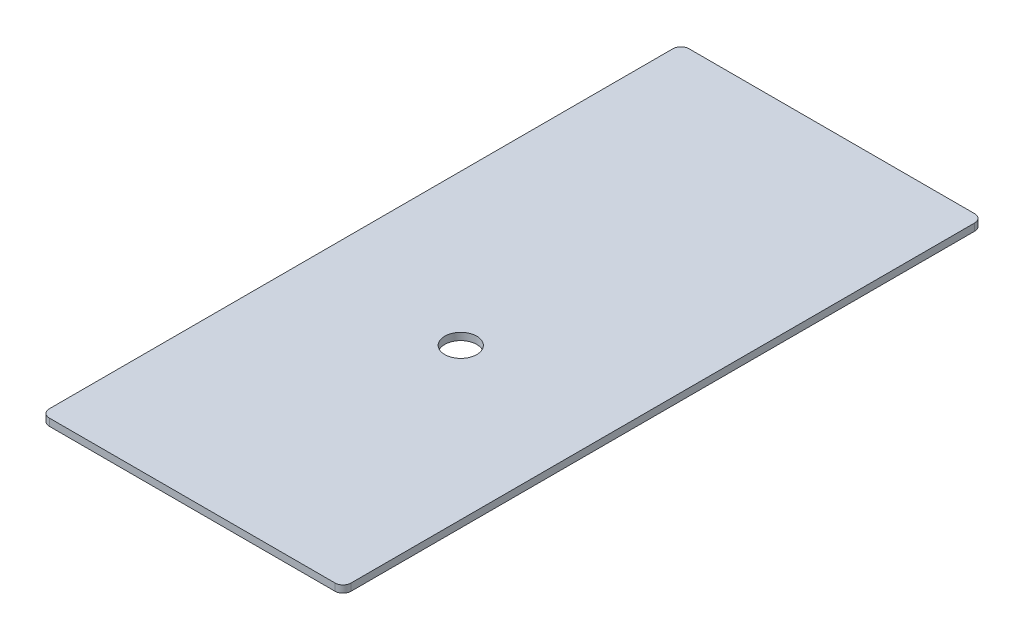
ISO-10303-21;
HEADER;
FILE_DESCRIPTION(('STEP AP214'),'2;1');
FILE_NAME('part.step','',(''),(''),'','','');
FILE_SCHEMA(('AUTOMOTIVE_DESIGN { 1 0 10303 214 1 1 1 1 }'));
ENDSEC;
DATA;
#1=APPLICATION_CONTEXT('core data for automotive mechanical design processes');
#2=APPLICATION_PROTOCOL_DEFINITION('international standard','automotive_design',2000,#1);
#3=PRODUCT_CONTEXT('',#1,'mechanical');
#4=PRODUCT('Part','Part','',(#3));
#5=PRODUCT_RELATED_PRODUCT_CATEGORY('part','',(#4));
#6=PRODUCT_DEFINITION_FORMATION('','',#4);
#7=PRODUCT_DEFINITION_CONTEXT('part definition',#1,'design');
#8=PRODUCT_DEFINITION('design','',#6,#7);
#9=PRODUCT_DEFINITION_SHAPE('','',#8);
#10=(LENGTH_UNIT() NAMED_UNIT(*) SI_UNIT(.MILLI.,.METRE.));
#11=(NAMED_UNIT(*) PLANE_ANGLE_UNIT() SI_UNIT($,.RADIAN.));
#12=(NAMED_UNIT(*) SI_UNIT($,.STERADIAN.) SOLID_ANGLE_UNIT());
#13=UNCERTAINTY_MEASURE_WITH_UNIT(LENGTH_MEASURE(1.E-05),#10,'distance_accuracy_value','');
#14=(GEOMETRIC_REPRESENTATION_CONTEXT(3) GLOBAL_UNCERTAINTY_ASSIGNED_CONTEXT((#13)) GLOBAL_UNIT_ASSIGNED_CONTEXT((#10,
#11,#12)) REPRESENTATION_CONTEXT('',''));
#15=CARTESIAN_POINT('',(0.,0.,0.));
#16=DIRECTION('',(0.,0.,1.));
#17=DIRECTION('',(1.,0.,0.));
#18=AXIS2_PLACEMENT_3D('',#15,#16,#17);
#19=CARTESIAN_POINT('',(0.,4.5,0.));
#20=DIRECTION('',(1.,0.,0.));
#21=DIRECTION('',(0.,0.,-1.));
#22=AXIS2_PLACEMENT_3D('',#19,#20,#21);
#23=PLANE('',#22);
#24=DIRECTION('',(0.,0.,1.));
#25=VECTOR('',#24,1.);
#26=CARTESIAN_POINT('',(0.,4.5,0.));
#27=LINE('',#26,#25);
#28=CARTESIAN_POINT('',(0.,4.5,-395.));
#29=VERTEX_POINT('',#28);
#30=CARTESIAN_POINT('',(0.,4.5,-5.));
#31=VERTEX_POINT('',#30);
#32=EDGE_CURVE('E131',#29,#31,#27,.T.);
#33=ORIENTED_EDGE('',*,*,#32,.F.);
#34=DIRECTION('',(0.,-1.,0.));
#35=VECTOR('',#34,1.);
#36=CARTESIAN_POINT('',(0.,4.5,-395.));
#37=LINE('',#36,#35);
#38=CARTESIAN_POINT('',(0.,0.,-395.));
#39=VERTEX_POINT('',#38);
#40=EDGE_CURVE('E116',#29,#39,#37,.T.);
#41=ORIENTED_EDGE('',*,*,#40,.T.);
#42=DIRECTION('',(0.,0.,1.));
#43=VECTOR('',#42,1.);
#44=CARTESIAN_POINT('',(0.,0.,0.));
#45=LINE('',#44,#43);
#46=CARTESIAN_POINT('',(0.,0.,-5.));
#47=VERTEX_POINT('',#46);
#48=EDGE_CURVE('E128',#39,#47,#45,.T.);
#49=ORIENTED_EDGE('',*,*,#48,.T.);
#50=DIRECTION('',(0.,-1.,0.));
#51=VECTOR('',#50,1.);
#52=CARTESIAN_POINT('',(0.,4.5,-5.));
#53=LINE('',#52,#51);
#54=EDGE_CURVE('E133',#47,#31,#53,.F.);
#55=ORIENTED_EDGE('',*,*,#54,.T.);
#56=EDGE_LOOP('',(#33,#41,#49,#55));
#57=FACE_BOUND('',#56,.T.);
#58=ADVANCED_FACE('F44',(#57),#23,.F.);
#59=CARTESIAN_POINT('',(0.,4.5,0.));
#60=DIRECTION('',(0.,0.,-1.));
#61=DIRECTION('',(-1.,0.,0.));
#62=AXIS2_PLACEMENT_3D('',#59,#60,#61);
#63=PLANE('',#62);
#64=DIRECTION('',(1.,0.,0.));
#65=VECTOR('',#64,1.);
#66=CARTESIAN_POINT('',(0.,4.5,0.));
#67=LINE('',#66,#65);
#68=CARTESIAN_POINT('',(5.,4.5,0.));
#69=VERTEX_POINT('',#68);
#70=CARTESIAN_POINT('',(183.7,4.5,0.));
#71=VERTEX_POINT('',#70);
#72=EDGE_CURVE('E174',#69,#71,#67,.T.);
#73=ORIENTED_EDGE('',*,*,#72,.F.);
#74=DIRECTION('',(0.,-1.,0.));
#75=VECTOR('',#74,1.);
#76=CARTESIAN_POINT('',(5.,4.5,0.));
#77=LINE('',#76,#75);
#78=CARTESIAN_POINT('',(5.,0.,0.));
#79=VERTEX_POINT('',#78);
#80=EDGE_CURVE('E11',#69,#79,#77,.T.);
#81=ORIENTED_EDGE('',*,*,#80,.T.);
#82=DIRECTION('',(1.,0.,0.));
#83=VECTOR('',#82,1.);
#84=CARTESIAN_POINT('',(0.,0.,0.));
#85=LINE('',#84,#83);
#86=CARTESIAN_POINT('',(183.7,0.,0.));
#87=VERTEX_POINT('',#86);
#88=EDGE_CURVE('E138',#79,#87,#85,.T.);
#89=ORIENTED_EDGE('',*,*,#88,.T.);
#90=DIRECTION('',(0.,-1.,0.));
#91=VECTOR('',#90,1.);
#92=CARTESIAN_POINT('',(183.7,4.5,0.));
#93=LINE('',#92,#91);
#94=EDGE_CURVE('E53',#87,#71,#93,.F.);
#95=ORIENTED_EDGE('',*,*,#94,.T.);
#96=EDGE_LOOP('',(#73,#81,#89,#95));
#97=FACE_BOUND('',#96,.T.);
#98=ADVANCED_FACE('F173',(#97),#63,.F.);
#99=CARTESIAN_POINT('',(188.7,4.5,0.));
#100=DIRECTION('',(-1.,0.,0.));
#101=DIRECTION('',(0.,0.,1.));
#102=AXIS2_PLACEMENT_3D('',#99,#100,#101);
#103=PLANE('',#102);
#104=DIRECTION('',(0.,0.,-1.));
#105=VECTOR('',#104,1.);
#106=CARTESIAN_POINT('',(188.7,0.,0.));
#107=LINE('',#106,#105);
#108=CARTESIAN_POINT('',(188.7,0.,-5.));
#109=VERTEX_POINT('',#108);
#110=CARTESIAN_POINT('',(188.7,0.,-395.));
#111=VERTEX_POINT('',#110);
#112=EDGE_CURVE('E141',#109,#111,#107,.T.);
#113=ORIENTED_EDGE('',*,*,#112,.T.);
#114=DIRECTION('',(0.,-1.,0.));
#115=VECTOR('',#114,1.);
#116=CARTESIAN_POINT('',(188.7,4.5,-395.));
#117=LINE('',#116,#115);
#118=CARTESIAN_POINT('',(188.7,4.5,-395.));
#119=VERTEX_POINT('',#118);
#120=EDGE_CURVE('E60',#111,#119,#117,.F.);
#121=ORIENTED_EDGE('',*,*,#120,.T.);
#122=DIRECTION('',(0.,0.,-1.));
#123=VECTOR('',#122,1.);
#124=CARTESIAN_POINT('',(188.7,4.5,0.));
#125=LINE('',#124,#123);
#126=CARTESIAN_POINT('',(188.7,4.5,-5.));
#127=VERTEX_POINT('',#126);
#128=EDGE_CURVE('E180',#127,#119,#125,.T.);
#129=ORIENTED_EDGE('',*,*,#128,.F.);
#130=DIRECTION('',(0.,-1.,0.));
#131=VECTOR('',#130,1.);
#132=CARTESIAN_POINT('',(188.7,4.5,-5.));
#133=LINE('',#132,#131);
#134=EDGE_CURVE('E166',#127,#109,#133,.T.);
#135=ORIENTED_EDGE('',*,*,#134,.T.);
#136=EDGE_LOOP('',(#113,#121,#129,#135));
#137=FACE_BOUND('',#136,.T.);
#138=ADVANCED_FACE('F184',(#137),#103,.F.);
#139=CARTESIAN_POINT('',(0.,4.5,-400.));
#140=DIRECTION('',(0.,0.,1.));
#141=DIRECTION('',(1.,0.,0.));
#142=AXIS2_PLACEMENT_3D('',#139,#140,#141);
#143=PLANE('',#142);
#144=DIRECTION('',(-1.,0.,0.));
#145=VECTOR('',#144,1.);
#146=CARTESIAN_POINT('',(0.,0.,-400.));
#147=LINE('',#146,#145);
#148=CARTESIAN_POINT('',(183.7,0.,-400.));
#149=VERTEX_POINT('',#148);
#150=CARTESIAN_POINT('',(5.,0.,-400.));
#151=VERTEX_POINT('',#150);
#152=EDGE_CURVE('E150',#149,#151,#147,.T.);
#153=ORIENTED_EDGE('',*,*,#152,.T.);
#154=DIRECTION('',(0.,-1.,0.));
#155=VECTOR('',#154,1.);
#156=CARTESIAN_POINT('',(5.,4.5,-400.));
#157=LINE('',#156,#155);
#158=CARTESIAN_POINT('',(5.,4.5,-400.));
#159=VERTEX_POINT('',#158);
#160=EDGE_CURVE('E117',#151,#159,#157,.F.);
#161=ORIENTED_EDGE('',*,*,#160,.T.);
#162=DIRECTION('',(-1.,0.,0.));
#163=VECTOR('',#162,1.);
#164=CARTESIAN_POINT('',(0.,4.5,-400.));
#165=LINE('',#164,#163);
#166=CARTESIAN_POINT('',(183.7,4.5,-400.));
#167=VERTEX_POINT('',#166);
#168=EDGE_CURVE('E146',#167,#159,#165,.T.);
#169=ORIENTED_EDGE('',*,*,#168,.F.);
#170=DIRECTION('',(0.,-1.,0.));
#171=VECTOR('',#170,1.);
#172=CARTESIAN_POINT('',(183.7,4.5,-400.));
#173=LINE('',#172,#171);
#174=EDGE_CURVE('E122',#167,#149,#173,.T.);
#175=ORIENTED_EDGE('',*,*,#174,.T.);
#176=EDGE_LOOP('',(#153,#161,#169,#175));
#177=FACE_BOUND('',#176,.T.);
#178=ADVANCED_FACE('F191',(#177),#143,.F.);
#179=CARTESIAN_POINT('',(0.,4.5,0.));
#180=DIRECTION('',(0.,-1.,0.));
#181=DIRECTION('',(0.,0.,-1.));
#182=AXIS2_PLACEMENT_3D('',#179,#180,#181);
#183=PLANE('',#182);
#184=CARTESIAN_POINT('',(94.3066017177937,4.5,-168.));
#185=DIRECTION('',(0.,1.,0.));
#186=DIRECTION('',(0.,0.,1.));
#187=AXIS2_PLACEMENT_3D('',#184,#185,#186);
#188=CIRCLE('',#187,10.);
#189=CARTESIAN_POINT('',(94.3066017177937,4.5,-158.));
#190=VERTEX_POINT('',#189);
#191=EDGE_CURVE('E144',#190,#190,#188,.T.);
#192=ORIENTED_EDGE('',*,*,#191,.F.);
#193=EDGE_LOOP('',(#192));
#194=FACE_BOUND('',#193,.T.);
#195=ORIENTED_EDGE('',*,*,#168,.T.);
#196=CARTESIAN_POINT('',(5.,4.5,-395.));
#197=DIRECTION('',(0.,-1.,0.));
#198=DIRECTION('',(0.,0.,-1.));
#199=AXIS2_PLACEMENT_3D('',#196,#197,#198);
#200=CIRCLE('',#199,5.);
#201=EDGE_CURVE('E164',#159,#29,#200,.F.);
#202=ORIENTED_EDGE('',*,*,#201,.T.);
#203=ORIENTED_EDGE('',*,*,#32,.T.);
#204=CARTESIAN_POINT('',(5.,4.5,-5.));
#205=DIRECTION('',(0.,-1.,0.));
#206=DIRECTION('',(0.,0.,-1.));
#207=AXIS2_PLACEMENT_3D('',#204,#205,#206);
#208=CIRCLE('',#207,5.);
#209=EDGE_CURVE('E160',#31,#69,#208,.F.);
#210=ORIENTED_EDGE('',*,*,#209,.T.);
#211=ORIENTED_EDGE('',*,*,#72,.T.);
#212=CARTESIAN_POINT('',(183.7,4.5,-5.));
#213=DIRECTION('',(0.,-1.,0.));
#214=DIRECTION('',(0.,0.,-1.));
#215=AXIS2_PLACEMENT_3D('',#212,#213,#214);
#216=CIRCLE('',#215,5.);
#217=EDGE_CURVE('E67',#71,#127,#216,.F.);
#218=ORIENTED_EDGE('',*,*,#217,.T.);
#219=ORIENTED_EDGE('',*,*,#128,.T.);
#220=CARTESIAN_POINT('',(183.7,4.5,-395.));
#221=DIRECTION('',(0.,-1.,0.));
#222=DIRECTION('',(0.,0.,-1.));
#223=AXIS2_PLACEMENT_3D('',#220,#221,#222);
#224=CIRCLE('',#223,5.);
#225=EDGE_CURVE('E162',#119,#167,#224,.F.);
#226=ORIENTED_EDGE('',*,*,#225,.T.);
#227=EDGE_LOOP('',(#195,#202,#203,#210,#211,#218,#219,#226));
#228=FACE_BOUND('',#227,.T.);
#229=ADVANCED_FACE('F178',(#194,#228),#183,.F.);
#230=CARTESIAN_POINT('',(0.,0.,0.));
#231=DIRECTION('',(0.,-1.,0.));
#232=DIRECTION('',(0.,0.,-1.));
#233=AXIS2_PLACEMENT_3D('',#230,#231,#232);
#234=PLANE('',#233);
#235=CARTESIAN_POINT('',(94.3066017177937,0.,-168.));
#236=DIRECTION('',(0.,-1.,0.));
#237=DIRECTION('',(0.,0.,-1.));
#238=AXIS2_PLACEMENT_3D('',#235,#236,#237);
#239=CIRCLE('',#238,10.);
#240=CARTESIAN_POINT('',(94.3066017177937,0.,-178.));
#241=VERTEX_POINT('',#240);
#242=EDGE_CURVE('E48',#241,#241,#239,.T.);
#243=ORIENTED_EDGE('',*,*,#242,.F.);
#244=EDGE_LOOP('',(#243));
#245=FACE_BOUND('',#244,.T.);
#246=ORIENTED_EDGE('',*,*,#48,.F.);
#247=CARTESIAN_POINT('',(5.,0.,-395.));
#248=DIRECTION('',(0.,-1.,0.));
#249=DIRECTION('',(0.,0.,-1.));
#250=AXIS2_PLACEMENT_3D('',#247,#248,#249);
#251=CIRCLE('',#250,5.);
#252=EDGE_CURVE('E112',#39,#151,#251,.T.);
#253=ORIENTED_EDGE('',*,*,#252,.T.);
#254=ORIENTED_EDGE('',*,*,#152,.F.);
#255=CARTESIAN_POINT('',(183.7,0.,-395.));
#256=DIRECTION('',(0.,-1.,0.));
#257=DIRECTION('',(0.,0.,-1.));
#258=AXIS2_PLACEMENT_3D('',#255,#256,#257);
#259=CIRCLE('',#258,5.);
#260=EDGE_CURVE('E123',#149,#111,#259,.T.);
#261=ORIENTED_EDGE('',*,*,#260,.T.);
#262=ORIENTED_EDGE('',*,*,#112,.F.);
#263=CARTESIAN_POINT('',(183.7,0.,-5.));
#264=DIRECTION('',(0.,-1.,0.));
#265=DIRECTION('',(0.,0.,-1.));
#266=AXIS2_PLACEMENT_3D('',#263,#264,#265);
#267=CIRCLE('',#266,5.);
#268=EDGE_CURVE('E132',#109,#87,#267,.T.);
#269=ORIENTED_EDGE('',*,*,#268,.T.);
#270=ORIENTED_EDGE('',*,*,#88,.F.);
#271=CARTESIAN_POINT('',(5.,0.,-5.));
#272=DIRECTION('',(0.,-1.,0.));
#273=DIRECTION('',(0.,0.,-1.));
#274=AXIS2_PLACEMENT_3D('',#271,#272,#273);
#275=CIRCLE('',#274,5.);
#276=EDGE_CURVE('E137',#79,#47,#275,.T.);
#277=ORIENTED_EDGE('',*,*,#276,.T.);
#278=EDGE_LOOP('',(#246,#253,#254,#261,#262,#269,#270,#277));
#279=FACE_BOUND('',#278,.T.);
#280=ADVANCED_FACE('F135',(#245,#279),#234,.T.);
#281=CARTESIAN_POINT('',(5.,4.5,-395.));
#282=DIRECTION('',(0.,-1.,0.));
#283=DIRECTION('',(0.,0.,-1.));
#284=AXIS2_PLACEMENT_3D('',#281,#282,#283);
#285=CYLINDRICAL_SURFACE('',#284,5.);
#286=ORIENTED_EDGE('',*,*,#201,.F.);
#287=ORIENTED_EDGE('',*,*,#160,.F.);
#288=ORIENTED_EDGE('',*,*,#252,.F.);
#289=ORIENTED_EDGE('',*,*,#40,.F.);
#290=EDGE_LOOP('',(#286,#287,#288,#289));
#291=FACE_BOUND('',#290,.T.);
#292=ADVANCED_FACE('F115',(#291),#285,.T.);
#293=CARTESIAN_POINT('',(183.7,4.5,-395.));
#294=DIRECTION('',(0.,-1.,0.));
#295=DIRECTION('',(0.,0.,-1.));
#296=AXIS2_PLACEMENT_3D('',#293,#294,#295);
#297=CYLINDRICAL_SURFACE('',#296,5.);
#298=ORIENTED_EDGE('',*,*,#225,.F.);
#299=ORIENTED_EDGE('',*,*,#120,.F.);
#300=ORIENTED_EDGE('',*,*,#260,.F.);
#301=ORIENTED_EDGE('',*,*,#174,.F.);
#302=EDGE_LOOP('',(#298,#299,#300,#301));
#303=FACE_BOUND('',#302,.T.);
#304=ADVANCED_FACE('F188',(#303),#297,.T.);
#305=CARTESIAN_POINT('',(5.,4.5,-5.));
#306=DIRECTION('',(0.,-1.,0.));
#307=DIRECTION('',(0.,0.,-1.));
#308=AXIS2_PLACEMENT_3D('',#305,#306,#307);
#309=CYLINDRICAL_SURFACE('',#308,5.);
#310=ORIENTED_EDGE('',*,*,#209,.F.);
#311=ORIENTED_EDGE('',*,*,#54,.F.);
#312=ORIENTED_EDGE('',*,*,#276,.F.);
#313=ORIENTED_EDGE('',*,*,#80,.F.);
#314=EDGE_LOOP('',(#310,#311,#312,#313));
#315=FACE_BOUND('',#314,.T.);
#316=ADVANCED_FACE('F221',(#315),#309,.T.);
#317=CARTESIAN_POINT('',(183.7,4.5,-5.));
#318=DIRECTION('',(0.,-1.,0.));
#319=DIRECTION('',(0.,0.,-1.));
#320=AXIS2_PLACEMENT_3D('',#317,#318,#319);
#321=CYLINDRICAL_SURFACE('',#320,5.);
#322=ORIENTED_EDGE('',*,*,#217,.F.);
#323=ORIENTED_EDGE('',*,*,#94,.F.);
#324=ORIENTED_EDGE('',*,*,#268,.F.);
#325=ORIENTED_EDGE('',*,*,#134,.F.);
#326=EDGE_LOOP('',(#322,#323,#324,#325));
#327=FACE_BOUND('',#326,.T.);
#328=ADVANCED_FACE('F46',(#327),#321,.T.);
#329=CARTESIAN_POINT('',(94.3066017177937,-15.5,-168.));
#330=DIRECTION('',(0.,1.,0.));
#331=DIRECTION('',(0.,0.,1.));
#332=AXIS2_PLACEMENT_3D('',#329,#330,#331);
#333=CYLINDRICAL_SURFACE('',#332,10.);
#334=ORIENTED_EDGE('',*,*,#242,.T.);
#335=EDGE_LOOP('',(#334));
#336=FACE_BOUND('',#335,.T.);
#337=ORIENTED_EDGE('',*,*,#191,.T.);
#338=EDGE_LOOP('',(#337));
#339=FACE_BOUND('',#338,.T.);
#340=ADVANCED_FACE('F197',(#336,#339),#333,.F.);
#341=CLOSED_SHELL('',(#58,#98,#138,#178,#229,#280,#292,#304,#316,#328,#340));
#342=MANIFOLD_SOLID_BREP('B2',#341);
#343=ADVANCED_BREP_SHAPE_REPRESENTATION('',(#18,#342),#14);
#344=SHAPE_DEFINITION_REPRESENTATION(#9,#343);
ENDSEC;
END-ISO-10303-21;
